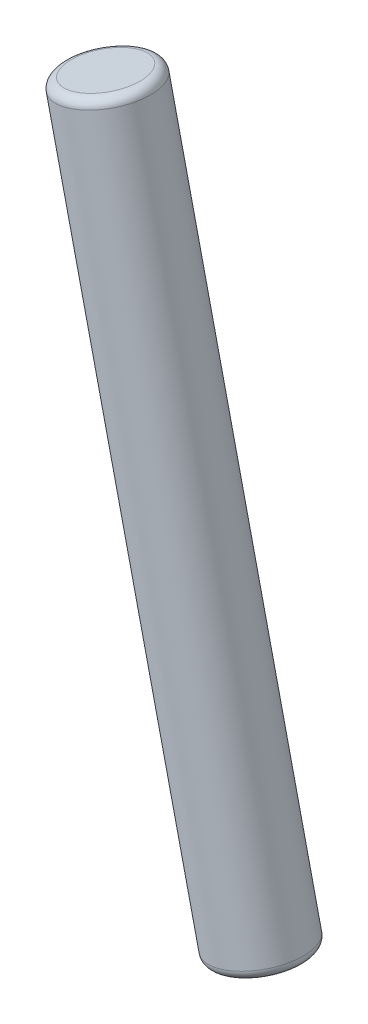
ISO-10303-21;
HEADER;
FILE_DESCRIPTION(('STEP AP214'),'2;1');
FILE_NAME('part.step','',(''),(''),'','','');
FILE_SCHEMA(('AUTOMOTIVE_DESIGN { 1 0 10303 214 1 1 1 1 }'));
ENDSEC;
DATA;
#1=APPLICATION_CONTEXT('core data for automotive mechanical design processes');
#2=APPLICATION_PROTOCOL_DEFINITION('international standard','automotive_design',2000,#1);
#3=PRODUCT_CONTEXT('',#1,'mechanical');
#4=PRODUCT('Part','Part','',(#3));
#5=PRODUCT_RELATED_PRODUCT_CATEGORY('part','',(#4));
#6=PRODUCT_DEFINITION_FORMATION('','',#4);
#7=PRODUCT_DEFINITION_CONTEXT('part definition',#1,'design');
#8=PRODUCT_DEFINITION('design','',#6,#7);
#9=PRODUCT_DEFINITION_SHAPE('','',#8);
#10=(LENGTH_UNIT() NAMED_UNIT(*) SI_UNIT(.MILLI.,.METRE.));
#11=(NAMED_UNIT(*) PLANE_ANGLE_UNIT() SI_UNIT($,.RADIAN.));
#12=(NAMED_UNIT(*) SI_UNIT($,.STERADIAN.) SOLID_ANGLE_UNIT());
#13=UNCERTAINTY_MEASURE_WITH_UNIT(LENGTH_MEASURE(1.E-05),#10,'distance_accuracy_value','');
#14=(GEOMETRIC_REPRESENTATION_CONTEXT(3) GLOBAL_UNCERTAINTY_ASSIGNED_CONTEXT((#13)) GLOBAL_UNIT_ASSIGNED_CONTEXT((#10,
#11,#12)) REPRESENTATION_CONTEXT('',''));
#15=CARTESIAN_POINT('',(0.,0.,0.));
#16=DIRECTION('',(0.,0.,1.));
#17=DIRECTION('',(1.,0.,0.));
#18=AXIS2_PLACEMENT_3D('',#15,#16,#17);
#19=CARTESIAN_POINT('',(-21.1730605528005,-15.0897815367699,0.));
#20=DIRECTION('',(-0.222520933956318,0.974927912181823,0.));
#21=DIRECTION('',(-0.974927912181823,-0.222520933956318,0.));
#22=AXIS2_PLACEMENT_3D('',#19,#20,#21);
#23=PLANE('',#22);
#24=CARTESIAN_POINT('',(-20.1981628401016,-14.8672674956484,0.00787091342527407));
#25=CARTESIAN_POINT('',(-20.1981529206122,-14.8672652315897,0.00657899610447102));
#26=CARTESIAN_POINT('',(-20.1981454142962,-14.8672635183221,0.00528705543710076));
#27=CARTESIAN_POINT('',(-20.1981377041067,-14.8672617585216,0.00333422628621672));
#28=CARTESIAN_POINT('',(-20.1981357242379,-14.8672613066294,0.00267334428524257));
#29=CARTESIAN_POINT('',(-20.1981330009584,-14.8672606850585,0.00134164303913538));
#30=CARTESIAN_POINT('',(-20.1981322765856,-14.8672605197251,0.000670823783469052));
#31=CARTESIAN_POINT('',(-20.1981306354053,-14.8672601451333,-0.0159212011125763));
#32=CARTESIAN_POINT('',(-20.198499718446,-14.8673443859071,-0.0318449527190452));
#33=CARTESIAN_POINT('',(-20.1999788641754,-14.8676819911907,-0.0636549444015571));
#34=CARTESIAN_POINT('',(-20.2010889305999,-14.8679353565532,-0.0795411842880794));
#35=CARTESIAN_POINT('',(-20.2040473820285,-14.8686106036455,-0.111241607180565));
#36=CARTESIAN_POINT('',(-20.2058957706376,-14.8690324861982,-0.127055789834311));
#37=CARTESIAN_POINT('',(-20.2103266922091,-14.8700438149343,-0.158575555767159));
#38=CARTESIAN_POINT('',(-20.2129092286395,-14.8706332619093,-0.174281138532882));
#39=CARTESIAN_POINT('',(-20.2188025506129,-14.8719783739428,-0.205547989830039));
#40=CARTESIAN_POINT('',(-20.2221133394804,-14.8727340397601,-0.221109257702315));
#41=CARTESIAN_POINT('',(-20.2294556194903,-14.8744098669646,-0.252051934002707));
#42=CARTESIAN_POINT('',(-20.2334871138085,-14.8753300290767,-0.267433341637972));
#43=CARTESIAN_POINT('',(-20.2422616169504,-14.8773327518254,-0.297981219665877));
#44=CARTESIAN_POINT('',(-20.2470046287963,-14.8784153131517,-0.313147689145244));
#45=CARTESIAN_POINT('',(-20.2571913294509,-14.8807403607331,-0.343231033536705));
#46=CARTESIAN_POINT('',(-20.2626350211245,-14.881982847642,-0.35814790742796));
#47=CARTESIAN_POINT('',(-20.2743764120553,-14.8846627430991,-0.388121107085888));
#48=CARTESIAN_POINT('',(-20.280694097989,-14.8861047134753,-0.403169200309476));
#49=CARTESIAN_POINT('',(-20.2940424687571,-14.8891513915631,-0.432928942456398));
#50=CARTESIAN_POINT('',(-20.3010731563542,-14.8907560999052,-0.447640590075863));
#51=CARTESIAN_POINT('',(-20.3158305786899,-14.8941243847987,-0.476691971272723));
#52=CARTESIAN_POINT('',(-20.3235573160084,-14.895887961939,-0.491031703471306));
#53=CARTESIAN_POINT('',(-20.3396881837559,-14.8995697267706,-0.51930461693864));
#54=CARTESIAN_POINT('',(-20.3480923165819,-14.9014879150091,-0.533237796768499));
#55=CARTESIAN_POINT('',(-20.365557691255,-14.9054742723284,-0.560663967422917));
#56=CARTESIAN_POINT('',(-20.3746189353169,-14.9075424419147,-0.574156956763503));
#57=CARTESIAN_POINT('',(-20.3933766600057,-14.9118237696867,-0.600670166365145));
#58=CARTESIAN_POINT('',(-20.403073142667,-14.9140369283367,-0.613690385111834));
#59=CARTESIAN_POINT('',(-20.4230779384937,-14.9186028919574,-0.639226616049456));
#60=CARTESIAN_POINT('',(-20.4333862535158,-14.920955697352,-0.651742626710038));
#61=CARTESIAN_POINT('',(-20.4545898303905,-14.9257952749277,-0.676240220942178));
#62=CARTESIAN_POINT('',(-20.4654850939258,-14.928282047493,-0.688221802981449));
#63=CARTESIAN_POINT('',(-20.4878362667652,-14.9333835563665,-0.711621609794442));
#64=CARTESIAN_POINT('',(-20.4992921775823,-14.93599829302,-0.723039833047573));
#65=CARTESIAN_POINT('',(-20.5227369900062,-14.9413494180033,-0.745285352228174));
#66=CARTESIAN_POINT('',(-20.5347258929618,-14.9440858066409,-0.756112646659907));
#67=CARTESIAN_POINT('',(-20.5592077475544,-14.9496736297466,-0.777150164873108));
#68=CARTESIAN_POINT('',(-20.5717007003824,-14.9525250644865,-0.787360387196323));
#69=CARTESIAN_POINT('',(-20.5971604953677,-14.9583360961232,-0.807139107738218));
#70=CARTESIAN_POINT('',(-20.6101273385652,-14.9612956932573,-0.816707604548179));
#71=CARTESIAN_POINT('',(-20.6365036105227,-14.9673159048033,-0.835179770026621));
#72=CARTESIAN_POINT('',(-20.6499130401798,-14.97037651942,-0.844083437347339));
#73=CARTESIAN_POINT('',(-20.677142112467,-14.9765913771001,-0.861204445029838));
#74=CARTESIAN_POINT('',(-20.6909617558598,-14.9797456203376,-0.869421784115556));
#75=CARTESIAN_POINT('',(-20.7189778923812,-14.9861401203195,-0.885150293656153));
#76=CARTESIAN_POINT('',(-20.7331743861472,-14.9893803772093,-0.892661462916689));
#77=CARTESIAN_POINT('',(-20.7619099500974,-14.9959390818358,-0.90695949620411));
#78=CARTESIAN_POINT('',(-20.7764490208035,-14.9992575296916,-0.913746359127632));
#79=CARTESIAN_POINT('',(-20.805834638002,-15.0059646047609,-0.926579392012809));
#80=CARTESIAN_POINT('',(-20.8206811849112,-15.0093532320695,-0.932625560970542));
#81=CARTESIAN_POINT('',(-20.8506459113342,-15.0161924850729,-0.94396260665208));
#82=CARTESIAN_POINT('',(-20.8657640911704,-15.0196431108414,-0.949253482479032));
#83=CARTESIAN_POINT('',(-20.8962355842741,-15.026598030067,-0.959067166345111));
#84=CARTESIAN_POINT('',(-20.9115888977813,-15.030102323579,-0.963589973601217));
#85=CARTESIAN_POINT('',(-20.9424935912044,-15.0371561179864,-0.971856599347137));
#86=CARTESIAN_POINT('',(-20.9580449712891,-15.0407056189204,-0.975600417173629));
#87=CARTESIAN_POINT('',(-20.989308252511,-15.0478412586898,-0.982300024035243));
#88=CARTESIAN_POINT('',(-21.0050201537579,-15.0514273975502,-0.985255812531696));
#89=CARTESIAN_POINT('',(-21.0365665442839,-15.0586276552087,-0.990372223496477));
#90=CARTESIAN_POINT('',(-21.0524010336262,-15.0622417740211,-0.992532845554805));
#91=CARTESIAN_POINT('',(-21.0841543712652,-15.0694892660462,-0.996053706434051));
#92=CARTESIAN_POINT('',(-21.1000732195912,-15.0731226392656,-0.997413944976703));
#93=CARTESIAN_POINT('',(-21.1319568423842,-15.080399868066,-0.9993307542445));
#94=CARTESIAN_POINT('',(-21.1479216168594,-15.0840437236488,-0.999887324825211));
#95=CARTESIAN_POINT('',(-21.1798585482158,-15.0913331198202,-1.00019545415205));
#96=CARTESIAN_POINT('',(-21.195830705097,-15.0949786604088,-0.999947012888708));
#97=CARTESIAN_POINT('',(-21.2277438396909,-15.1022626251637,-0.998645718320171));
#98=CARTESIAN_POINT('',(-21.2436848174083,-15.1059010493312,-0.997592865140611));
#99=CARTESIAN_POINT('',(-21.2754971073851,-15.1131619969994,-0.994685288894073));
#100=CARTESIAN_POINT('',(-21.2913684196672,-15.1167845205054,-0.992830566087005));
#101=CARTESIAN_POINT('',(-21.3230030607127,-15.124004921003,-0.988323728962072));
#102=CARTESIAN_POINT('',(-21.3387663895293,-15.1276027980068,-0.985671615036586));
#103=CARTESIAN_POINT('',(-21.3701470063489,-15.1347652191705,-0.979576399457556));
#104=CARTESIAN_POINT('',(-21.3857642944484,-15.1383297633524,-0.976133298326086));
#105=CARTESIAN_POINT('',(-21.4168151252113,-15.1454169130377,-0.968464422057429));
#106=CARTESIAN_POINT('',(-21.4322486680268,-15.1489395185759,-0.964238647568278));
#107=CARTESIAN_POINT('',(-21.4628947473271,-15.1559342864171,-0.955014628166624));
#108=CARTESIAN_POINT('',(-21.478107284032,-15.1594064487703,-0.950016384023447));
#109=CARTESIAN_POINT('',(-21.5082746239271,-15.1662919475009,-0.939259494111981));
#110=CARTESIAN_POINT('',(-21.5232294274173,-15.1697052839466,-0.93350084922871));
#111=CARTESIAN_POINT('',(-21.552845196104,-15.1764648901812,-0.921237062702011));
#112=CARTESIAN_POINT('',(-21.567506161692,-15.1798111600592,-0.914731922052795));
#113=CARTESIAN_POINT('',(-21.5964988593908,-15.1864285544378,-0.900990851342103));
#114=CARTESIAN_POINT('',(-21.6108305919955,-15.189699679051,-0.893754922376661));
#115=CARTESIAN_POINT('',(-21.6391302236164,-15.196158885649,-0.878569746927125));
#116=CARTESIAN_POINT('',(-21.6530981232393,-15.1993469677723,-0.870620501632671));
#117=CARTESIAN_POINT('',(-21.6806363674131,-15.2056323926807,-0.854027887765389));
#118=CARTESIAN_POINT('',(-21.6942067126936,-15.2087297356324,-0.845384520466777));
#119=CARTESIAN_POINT('',(-21.7209170867604,-15.2148262046155,-0.82742453281922));
#120=CARTESIAN_POINT('',(-21.7340571164087,-15.2178253308436,-0.818107913819262));
#121=CARTESIAN_POINT('',(-21.7598751369643,-15.2237181259824,-0.798823918578047));
#122=CARTESIAN_POINT('',(-21.7725531288749,-15.226611795122,-0.788856543750011));
#123=CARTESIAN_POINT('',(-21.7974164674883,-15.2322866903557,-0.768295103909819));
#124=CARTESIAN_POINT('',(-21.8096018153437,-15.235067916713,-0.757701040363885));
#125=CARTESIAN_POINT('',(-21.8334504490688,-15.2405112121928,-0.735911803265544));
#126=CARTESIAN_POINT('',(-21.8451137362475,-15.2431732816142,-0.724716631220487));
#127=CARTESIAN_POINT('',(-21.8678900925654,-15.2483718367848,-0.701752208639952));
#128=CARTESIAN_POINT('',(-21.8790031631765,-15.2509083228701,-0.689982959640478));
#129=CARTESIAN_POINT('',(-21.9006522590189,-15.2558495882013,-0.66589880071838));
#130=CARTESIAN_POINT('',(-21.9111882858909,-15.2582543678218,-0.653583892347394));
#131=CARTESIAN_POINT('',(-21.9316578604086,-15.262926415112,-0.628438149666163));
#132=CARTESIAN_POINT('',(-21.9415914098685,-15.2651936831958,-0.615607316909679));
#133=CARTESIAN_POINT('',(-21.960832050624,-15.2695852343743,-0.589460706041784));
#134=CARTESIAN_POINT('',(-21.9701391439112,-15.2717095179235,-0.57614492947231));
#135=CARTESIAN_POINT('',(-21.9881044061904,-15.2758099722831,-0.549060582338917));
#136=CARTESIAN_POINT('',(-21.9967625773545,-15.2777861435891,-0.535292013290786));
#137=CARTESIAN_POINT('',(-22.0134090963114,-15.2815856033819,-0.507335325685179));
#138=CARTESIAN_POINT('',(-22.0213974464587,-15.2834088924061,-0.493147208602702));
#139=CARTESIAN_POINT('',(-22.0366850418155,-15.2868981867412,-0.464385682246527));
#140=CARTESIAN_POINT('',(-22.0439842895631,-15.2885641926314,-0.449812274392143));
#141=CARTESIAN_POINT('',(-22.0578760626346,-15.2917348996195,-0.420315353907216));
#142=CARTESIAN_POINT('',(-22.0644685906802,-15.2932396013387,-0.405391842625215));
#143=CARTESIAN_POINT('',(-22.0769310134117,-15.296084068415,-0.375230747810346));
#144=CARTESIAN_POINT('',(-22.082800911002,-15.2974238344349,-0.359993165540032));
#145=CARTESIAN_POINT('',(-22.0938039070866,-15.2999351968728,-0.329240719374494));
#146=CARTESIAN_POINT('',(-22.0989370086659,-15.301106793995,-0.313725856640557));
#147=CARTESIAN_POINT('',(-22.1084540255001,-15.3032789913304,-0.282456309368366));
#148=CARTESIAN_POINT('',(-22.1128379440178,-15.3042795922884,-0.26670162587486));
#149=CARTESIAN_POINT('',(-22.1208460192198,-15.3061073835015,-0.234990475823799));
#150=CARTESIAN_POINT('',(-22.1244701793405,-15.3069345745409,-0.219034010179252));
#151=CARTESIAN_POINT('',(-22.1309499871257,-15.3084135486413,-0.186957820893023));
#152=CARTESIAN_POINT('',(-22.1338056383953,-15.309065332525,-0.170838098017548));
#153=CARTESIAN_POINT('',(-22.1387415699755,-15.310191926902,-0.138474315331791));
#154=CARTESIAN_POINT('',(-22.1408218540536,-15.3106667382553,-0.12223025612605));
#155=CARTESIAN_POINT('',(-22.1442019293005,-15.3114382185162,-0.0896570137287813));
#156=CARTESIAN_POINT('',(-22.1455017243928,-15.3117348883194,-0.0733278309655872));
#157=CARTESIAN_POINT('',(-22.1473180909544,-15.3121494622092,-0.0406237893278862));
#158=CARTESIAN_POINT('',(-22.1478346664926,-15.3122673672245,-0.024248930691109));
#159=CARTESIAN_POINT('',(-22.1479582654995,-15.3122955778913,-0.00787091342531694));
#160=B_SPLINE_CURVE_WITH_KNOTS('',3,(#24,#25,#26,#27,#28,#29,#30,#31,#32,#33,#34,#35,#36,#37,
#38,#39,#40,#41,#42,#43,#44,#45,#46,#47,#48,#49,#50,#51,#52,#53,#54,#55,#56,#57,#58,#59,#60,#61,
#62,#63,#64,#65,#66,#67,#68,#69,#70,#71,#72,#73,#74,#75,#76,#77,#78,#79,#80,#81,#82,#83,#84,#85,
#86,#87,#88,#89,#90,#91,#92,#93,#94,#95,#96,#97,#98,#99,#100,#101,#102,#103,#104,#105,#106,#107,
#108,#109,#110,#111,#112,#113,#114,#115,#116,#117,#118,#119,#120,#121,#122,#123,#124,#125,#126,
#127,#128,#129,#130,#131,#132,#133,#134,#135,#136,#137,#138,#139,#140,#141,#142,#143,#144,#145,
#146,#147,#148,#149,#150,#151,#152,#153,#154,#155,#156,#157,#158,#159),.UNSPECIFIED.,.F.,.F.,(4,
2,2,2,2,2,2,2,2,2,2,2,2,2,2,2,2,2,2,2,2,2,2,2,2,2,2,2,2,2,2,2,2,2,2,2,2,2,2,2,2,2,2,2,2,2,2,2,2,
2,2,2,2,2,2,2,2,2,2,2,2,2,2,2,2,2,2,4),(0.,0.00387587630935156,0.00585852972615721,
0.0078709928851933,0.0556344018089354,0.10339805153398,0.151161934478224,0.198926043059565,
0.246690369695901,0.294454906805128,0.342219646805145,0.389984582113849,0.43911689607388,
0.488249400409967,0.537382086870033,0.586514947201998,0.635647973153784,0.684781156473313,
0.733914488908506,0.783047962207284,0.832181568117571,0.881315298387288,0.930449144764357,
0.979583098996699,1.02871715283224,1.07785129801889,1.12698552630459,1.17611982943724,
1.22525419916478,1.27438862723513,1.3235231053962,1.37265762539593,1.42179217898223,
1.47092675790302,1.52006135390623,1.56919595873978,1.61833056415159,1.66746516188958,
1.71659974370168,1.76573430133581,1.81486882653989,1.86400331106185,1.9131377466496,
1.96227212505107,2.01140643801417,2.06054067728684,2.10967483461699,2.15880890175256,
2.20794287044145,2.25707673243158,2.30621047947089,2.3553441033073,2.40447759568871,
2.45361094836307,2.50274415307829,2.55187720158229,2.60101008562299,2.65014279694831,
2.69927532730618,2.74840766844452,2.79753981211125,2.84667175005429,2.89580347402156,
2.94493497576098,2.99406624702048,3.04319727954798,3.0923280650914,3.14145859539866),.UNSPECIFIED.);
#161=CARTESIAN_POINT('',(-20.1981628401016,-14.8672674956484,0.00787091342527407));
#162=VERTEX_POINT('',#161);
#163=CARTESIAN_POINT('',(-22.1479582654995,-15.3122955778913,-0.00787091342531667));
#164=VERTEX_POINT('',#163);
#165=EDGE_CURVE('E44',#162,#164,#160,.T.);
#166=ORIENTED_EDGE('',*,*,#165,.F.);
#167=CARTESIAN_POINT('',(-21.1730605528005,-15.0897815367699,0.));
#168=DIRECTION('',(0.222520933956318,-0.974927912181823,0.));
#169=DIRECTION('',(0.974927912181823,0.222520933956318,0.));
#170=AXIS2_PLACEMENT_3D('',#167,#168,#169);
#171=CIRCLE('',#170,0.999999999999997);
#172=EDGE_CURVE('E22',#164,#162,#171,.F.);
#173=ORIENTED_EDGE('',*,*,#172,.F.);
#174=EDGE_LOOP('',(#166,#173));
#175=FACE_BOUND('',#174,.T.);
#176=ADVANCED_FACE('F17',(#175),#23,.F.);
#177=CARTESIAN_POINT('',(-25.6234792319269,4.4087767068666,0.));
#178=DIRECTION('',(-0.222520933956318,0.974927912181823,0.));
#179=DIRECTION('',(-0.974927912181823,-0.222520933956318,0.));
#180=AXIS2_PLACEMENT_3D('',#177,#178,#179);
#181=PLANE('',#180);
#182=CARTESIAN_POINT('',(-24.6485815192279,4.63129074798801,0.00787091342531693));
#183=CARTESIAN_POINT('',(-24.6486727398425,4.631269927478,0.0197705211102563));
#184=CARTESIAN_POINT('',(-24.6489712283922,4.63120179941436,0.0316684493908223));
#185=CARTESIAN_POINT('',(-24.6499819451551,4.63097110990877,0.0554458036296425));
#186=CARTESIAN_POINT('',(-24.6506941733684,4.6308085484668,0.0673252295878968));
#187=CARTESIAN_POINT('',(-24.6525315732524,4.63038917393345,0.0910504356685289));
#188=CARTESIAN_POINT('',(-24.653656744923,4.63013236084206,0.102896215790907));
#189=CARTESIAN_POINT('',(-24.6563185680055,4.6295248170935,0.126539035880564));
#190=CARTESIAN_POINT('',(-24.6578552194173,4.62917408643634,0.138336075847843));
#191=CARTESIAN_POINT('',(-24.6613380517521,4.62837915268353,0.161866381727179));
#192=CARTESIAN_POINT('',(-24.663284232675,4.62793494958789,0.173599647639236));
#193=CARTESIAN_POINT('',(-24.6675836417755,4.62695363751698,0.196987453231987));
#194=CARTESIAN_POINT('',(-24.6699368699529,4.62641652854172,0.208641992912681));
#195=CARTESIAN_POINT('',(-24.6750473753036,4.6252500890446,0.231857494069693));
#196=CARTESIAN_POINT('',(-24.6778046524767,4.62462075852275,0.243418455546011));
#197=CARTESIAN_POINT('',(-24.6837197419322,4.62327067795411,0.266432067605087));
#198=CARTESIAN_POINT('',(-24.6868775542145,4.62254992790731,0.277884718187845));
#199=CARTESIAN_POINT('',(-24.6935896897757,4.62101792676626,0.300667113787736));
#200=CARTESIAN_POINT('',(-24.6971440130545,4.62020667567199,0.311996858804868));
#201=CARTESIAN_POINT('',(-24.7046446411504,4.61849470625526,0.334519005228325));
#202=CARTESIAN_POINT('',(-24.7085909459675,4.6175939879328,0.34571140663465));
#203=CARTESIAN_POINT('',(-24.7168705081746,4.61570423188823,0.367944602814335));
#204=CARTESIAN_POINT('',(-24.7212037655646,4.61471519416612,0.378985397587695));
#205=CARTESIAN_POINT('',(-24.7302517108357,4.61265005970135,0.400901310679173));
#206=CARTESIAN_POINT('',(-24.7349663987169,4.61157396295869,0.411776428997291));
#207=CARTESIAN_POINT('',(-24.7447711968143,4.60933608177523,0.433347130485538));
#208=CARTESIAN_POINT('',(-24.7498613070306,4.60817429733444,0.444042713655666));
#209=CARTESIAN_POINT('',(-24.7604104632229,4.60576652127321,0.465240714945576));
#210=CARTESIAN_POINT('',(-24.765869509199,4.60452052965278,0.475743133065357));
#211=CARTESIAN_POINT('',(-24.7771495801829,4.60194592706005,0.496541420511842));
#212=CARTESIAN_POINT('',(-24.7829706051907,4.60061731608775,0.506837289838545));
#213=CARTESIAN_POINT('',(-24.7949672162225,4.59787916790495,0.527209359171327));
#214=CARTESIAN_POINT('',(-24.8011428022465,4.59646963069444,0.537285559177404));
#215=CARTESIAN_POINT('',(-24.8138406654606,4.59357142627711,0.557205449276696));
#216=CARTESIAN_POINT('',(-24.8203629426508,4.59208275907028,0.56704913936991));
#217=CARTESIAN_POINT('',(-24.8337458765421,4.5890281917414,0.586491465349938));
#218=CARTESIAN_POINT('',(-24.8406065332432,4.58746229161935,0.596090101236751));
#219=CARTESIAN_POINT('',(-24.8546574832873,4.58425525396279,0.615030086794951));
#220=CARTESIAN_POINT('',(-24.8618477766304,4.58261411642829,0.624371436466336));
#221=CARTESIAN_POINT('',(-24.8765488370177,4.57925869532827,0.642784945456996));
#222=CARTESIAN_POINT('',(-24.8840596040619,4.57754441176276,0.651857104776272));
#223=CARTESIAN_POINT('',(-24.8993920405154,4.57404488319576,0.669720671968407));
#224=CARTESIAN_POINT('',(-24.9072137099246,4.57225963819426,0.678512079841267));
#225=CARTESIAN_POINT('',(-24.923157983574,4.5686204617799,0.695802940821497));
#226=CARTESIAN_POINT('',(-24.9312805878141,4.56676653036704,0.704302393928868));
#227=CARTESIAN_POINT('',(-24.9478163800952,4.56299234368501,0.720998514111224));
#228=CARTESIAN_POINT('',(-24.9562295681362,4.56107208841583,0.729195181186209));
#229=CARTESIAN_POINT('',(-24.9733358066839,4.55716770109596,0.745275283891874));
#230=CARTESIAN_POINT('',(-24.9820288571906,4.55518356904526,0.753158719522555));
#231=CARTESIAN_POINT('',(-24.9996837426922,4.55115395663841,0.768602313093776));
#232=CARTESIAN_POINT('',(-25.0086455776872,4.54910847628226,0.776162471034315));
#233=CARTESIAN_POINT('',(-25.0268266116626,4.54495877391969,0.790949874947917));
#234=CARTESIAN_POINT('',(-25.0360458106431,4.54285455191329,0.798177120920978));
#235=CARTESIAN_POINT('',(-25.0547298241157,4.53859004776277,0.812289490868213));
#236=CARTESIAN_POINT('',(-25.0641946386077,4.53642976561865,0.819174614842387));
#237=CARTESIAN_POINT('',(-25.0833578216292,4.53205589414544,0.832593966743157));
#238=CARTESIAN_POINT('',(-25.0930561901588,4.52984230481634,0.839128194669753));
#239=CARTESIAN_POINT('',(-25.1126741221523,4.52536463985779,0.851837427590597));
#240=CARTESIAN_POINT('',(-25.1225936856162,4.52310056422835,0.858012432584845));
#241=CARTESIAN_POINT('',(-25.1426413664958,4.51852481189093,0.869995350531482));
#242=CARTESIAN_POINT('',(-25.1527694839114,4.51621313518296,0.875803263483871));
#243=CARTESIAN_POINT('',(-25.1732213659413,4.51154512657064,0.887044596040594));
#244=CARTESIAN_POINT('',(-25.1835451305555,4.5091887946663,0.892478015644928));
#245=CARTESIAN_POINT('',(-25.2043751509067,4.50443447844974,0.902963437434242));
#246=CARTESIAN_POINT('',(-25.2148814066436,4.50203649413751,0.908015439619223));
#247=CARTESIAN_POINT('',(-25.236063020607,4.4972019289733,0.917731588558101));
#248=CARTESIAN_POINT('',(-25.2467383788335,4.49476534812132,0.922395735312));
#249=CARTESIAN_POINT('',(-25.2682445936471,4.48985669493129,0.931330229637123));
#250=CARTESIAN_POINT('',(-25.2790754502342,4.48738462259324,0.935600577208347));
#251=CARTESIAN_POINT('',(-25.3008788594822,4.48240813671293,0.943742031264905));
#252=CARTESIAN_POINT('',(-25.3118514121431,4.47990372317066,0.947613137750238));
#253=CARTESIAN_POINT('',(-25.3339242306763,4.47486574637907,0.954951176463461));
#254=CARTESIAN_POINT('',(-25.3450244965485,4.47233218312975,0.958418108691351));
#255=CARTESIAN_POINT('',(-25.367338595912,4.46723913556312,0.964943380928916));
#256=CARTESIAN_POINT('',(-25.3785524294034,4.46467965124583,0.96800172093859));
#257=CARTESIAN_POINT('',(-25.4010793736073,4.45953802323333,0.97370591090121));
#258=CARTESIAN_POINT('',(-25.4123924843198,4.45695587953813,0.976351760854155));
#259=CARTESIAN_POINT('',(-25.4351035663572,4.45177222326678,0.981227600635916));
#260=CARTESIAN_POINT('',(-25.4465015376821,4.44917071069063,0.983457590464732));
#261=CARTESIAN_POINT('',(-25.4693678150627,4.44395163209481,0.987498861988522));
#262=CARTESIAN_POINT('',(-25.4808361211184,4.44133406607515,0.989310143683495));
#263=CARTESIAN_POINT('',(-25.5038284566678,4.43608621552538,0.992511713967561));
#264=CARTESIAN_POINT('',(-25.5153524861613,4.43345593099527,0.993902002556654));
#265=CARTESIAN_POINT('',(-25.5384415705354,4.42818599815595,0.996259728211989));
#266=CARTESIAN_POINT('',(-25.5500066254158,4.42554634984673,0.997227165278232));
#267=CARTESIAN_POINT('',(-25.5731630689998,4.42026104271349,0.998738278621432));
#268=CARTESIAN_POINT('',(-25.5847544577033,4.41761538388948,0.999281954898388));
#269=CARTESIAN_POINT('',(-25.6079486244869,4.41232146665895,0.999943646191528));
#270=CARTESIAN_POINT('',(-25.6195514025669,4.40967320825244,1.00006166120771));
#271=CARTESIAN_POINT('',(-25.645643576657,4.40371783986038,0.999853314911651));
#272=CARTESIAN_POINT('',(-25.6601322021869,4.400410905765,0.999408959966023));
#273=CARTESIAN_POINT('',(-25.6890764901318,4.3938045596284,0.997869482750393));
#274=CARTESIAN_POINT('',(-25.7035321522001,4.39050514766629,0.996774353668499));
#275=CARTESIAN_POINT('',(-25.7323832108877,4.38392007187152,0.993933824075528));
#276=CARTESIAN_POINT('',(-25.7467786050019,4.38063440861033,0.992188396800902));
#277=CARTESIAN_POINT('',(-25.7754821887063,4.37408296889025,0.988051197711372));
#278=CARTESIAN_POINT('',(-25.7897903719567,4.37081719387716,0.985659379466702));
#279=CARTESIAN_POINT('',(-25.8147282167299,4.36512522446154,0.980911120931172));
#280=CARTESIAN_POINT('',(-25.8253835667641,4.36269317291061,0.978695218076478));
#281=CARTESIAN_POINT('',(-25.8466193129747,4.35784614918942,0.973906846120255));
#282=CARTESIAN_POINT('',(-25.857199702,4.35543117864869,0.971334343468757));
#283=CARTESIAN_POINT('',(-25.8747444681466,4.35142657876104,0.966746313352115));
#284=CARTESIAN_POINT('',(-25.8817343139803,4.34983114034073,0.964832397982198));
#285=CARTESIAN_POINT('',(-25.9026358232922,4.34506037304327,0.958839565105304));
#286=CARTESIAN_POINT('',(-25.9164799920304,4.34190047036779,0.954509435152599));
#287=CARTESIAN_POINT('',(-25.9439561260851,4.33562917345549,0.945194476612272));
#288=CARTESIAN_POINT('',(-25.9575880982137,4.33251777766145,0.940209669090303));
#289=CARTESIAN_POINT('',(-25.9846102016045,4.32635025619598,0.929596536395554));
#290=CARTESIAN_POINT('',(-25.9980003613493,4.32329412401513,0.923968287592204));
#291=CARTESIAN_POINT('',(-26.0245064891641,4.31724447275329,0.912075932700987));
#292=CARTESIAN_POINT('',(-26.0376225128719,4.31425094096705,0.905811957179647));
#293=CARTESIAN_POINT('',(-26.0570768147116,4.30981076693233,0.895964544510993));
#294=CARTESIAN_POINT('',(-26.0635245155947,4.30833916422467,0.892607083135159));
#295=CARTESIAN_POINT('',(-26.0763296153199,4.30541654185101,0.885718664694046));
#296=CARTESIAN_POINT('',(-26.0826870290912,4.30396551878215,0.882187736752998));
#297=CARTESIAN_POINT('',(-26.0943455909889,4.30130453729139,0.875628437439713));
#298=CARTESIAN_POINT('',(-26.0996523582752,4.30009329933085,0.872610454892624));
#299=CARTESIAN_POINT('',(-26.1152240275099,4.29653916296562,0.863561959756415));
#300=CARTESIAN_POINT('',(-26.1254124031318,4.29421373522682,0.857391890410283));
#301=CARTESIAN_POINT('',(-26.1507523372726,4.28843005519174,0.841411274862042));
#302=CARTESIAN_POINT('',(-26.1657608192099,4.28500445315153,0.831360820410464));
#303=CARTESIAN_POINT('',(-26.1939540792053,4.27856948433449,0.81131918297202));
#304=CARTESIAN_POINT('',(-26.2071851039081,4.27554956329675,0.801396323757868));
#305=CARTESIAN_POINT('',(-26.2310228689945,4.27010870371595,0.782541001249091));
#306=CARTESIAN_POINT('',(-26.2417061194557,4.26767030184119,0.773710362493863));
#307=CARTESIAN_POINT('',(-26.2562051298408,4.2643609815464,0.76118556792131));
#308=CARTESIAN_POINT('',(-26.2601848628479,4.2634526302968,0.757689649577746));
#309=CARTESIAN_POINT('',(-26.2714378534126,4.26088420279717,0.747638758182108));
#310=CARTESIAN_POINT('',(-26.2786429154649,4.25923969441018,0.741003023091419));
#311=CARTESIAN_POINT('',(-26.2928543169016,4.25599603929804,0.727512021845974));
#312=CARTESIAN_POINT('',(-26.2998606591347,4.25439689192258,0.720656758841462));
#313=CARTESIAN_POINT('',(-26.3159692198466,4.25072023412908,0.7044115735956));
#314=CARTESIAN_POINT('',(-26.3249917968913,4.24866090319073,0.694938290394925));
#315=CARTESIAN_POINT('',(-26.3426567835337,4.24462901680971,0.675627254432975));
#316=CARTESIAN_POINT('',(-26.3512992154189,4.2426564562798,0.665789523101306));
#317=CARTESIAN_POINT('',(-26.368190815356,4.2388010944753,0.645766333996917));
#318=CARTESIAN_POINT('',(-26.3764400153345,4.23691828591373,0.635580904569478));
#319=CARTESIAN_POINT('',(-26.3925281853735,4.23324629262188,0.61487636514271));
#320=CARTESIAN_POINT('',(-26.4003671979902,4.2314570981793,0.604357289941119));
#321=CARTESIAN_POINT('',(-26.4142986900813,4.22827732620547,0.584881451170083));
#322=CARTESIAN_POINT('',(-26.4204565870814,4.22687182040577,0.575973761195909));
#323=CARTESIAN_POINT('',(-26.4324985116458,4.22412331927604,0.557966601516301));
#324=CARTESIAN_POINT('',(-26.4383825584813,4.2227803195474,0.54886714537132));
#325=CARTESIAN_POINT('',(-26.4498685760271,4.22015870883001,0.530482985255211));
#326=CARTESIAN_POINT('',(-26.4554705536758,4.21888009625748,0.521198285848513));
#327=CARTESIAN_POINT('',(-26.4663869127388,4.21638851756711,0.502452899402465));
#328=CARTESIAN_POINT('',(-26.4717012880358,4.21517555284558,0.492992208625541));
#329=CARTESIAN_POINT('',(-26.4846261003046,4.21222555630912,0.469131816998046));
#330=CARTESIAN_POINT('',(-26.4920557837593,4.21052977561428,0.454628069240343));
#331=CARTESIAN_POINT('',(-26.5014918646483,4.2083759997133,0.435072706871333));
#332=CARTESIAN_POINT('',(-26.5038071391678,4.20784753656157,0.430175846321435));
#333=CARTESIAN_POINT('',(-26.510627281505,4.20629083415064,0.415423400917842));
#334=CARTESIAN_POINT('',(-26.5150063774266,4.2052913026324,0.405506131918163));
#335=CARTESIAN_POINT('',(-26.5234299871527,4.20336862747701,0.385523188353363));
#336=CARTESIAN_POINT('',(-26.5274744924019,4.20244548579314,0.375457510001195));
#337=CARTESIAN_POINT('',(-26.5352180320815,4.20067808161859,0.355187906999682));
#338=CARTESIAN_POINT('',(-26.5389170779748,4.19983381651066,0.344983986950321));
#339=CARTESIAN_POINT('',(-26.5459824496052,4.19822124516784,0.324456001449055));
#340=CARTESIAN_POINT('',(-26.5493488059034,4.19745293195594,0.314131947130372));
#341=CARTESIAN_POINT('',(-26.5556810227378,4.19600770481546,0.293357873965597));
#342=CARTESIAN_POINT('',(-26.5586469435547,4.1953307771299,0.282907874337603));
#343=CARTESIAN_POINT('',(-26.5619663321409,4.19457315076111,0.270848765138686));
#344=CARTESIAN_POINT('',(-26.5624011176897,4.19447391360305,0.269261761263503));
#345=CARTESIAN_POINT('',(-26.5640995243569,4.19408626287551,0.263000054622556));
#346=CARTESIAN_POINT('',(-26.5653323695226,4.19380487425102,0.258316499760229));
#347=CARTESIAN_POINT('',(-26.5685244437872,4.19307630442962,0.245833905506397));
#348=CARTESIAN_POINT('',(-26.5704259118467,4.19264230658992,0.23801930348355));
#349=CARTESIAN_POINT('',(-26.5752769559227,4.19153508714278,0.217002966311772));
#350=CARTESIAN_POINT('',(-26.5780575060003,4.19090044470189,0.203759977247555));
#351=CARTESIAN_POINT('',(-26.5839131441992,4.18956393317318,0.172834001034933));
#352=CARTESIAN_POINT('',(-26.5867888543593,4.18890757072226,0.155110687061624));
#353=CARTESIAN_POINT('',(-26.5901467712655,4.18814114762589,0.130299459639902));
#354=CARTESIAN_POINT('',(-26.5910243205125,4.18794085260736,0.123265750354809));
#355=CARTESIAN_POINT('',(-26.5926323189528,4.18757383730633,0.109180632171213));
#356=CARTESIAN_POINT('',(-26.5933627679374,4.18740711707148,0.102129223247607));
#357=CARTESIAN_POINT('',(-26.5956109488725,4.18689398456406,0.0779773236048316));
#358=CARTESIAN_POINT('',(-26.5967718589895,4.18662901481833,0.0608402213206685));
#359=CARTESIAN_POINT('',(-26.5981101047675,4.18632356975503,0.0291314794153301));
#360=CARTESIAN_POINT('',(-26.5984099453238,4.18625513348851,0.0145650857118345));
#361=CARTESIAN_POINT('',(-26.598407147422,4.18625577216487,-0.00262370902903635));
#362=CARTESIAN_POINT('',(-26.5983969138024,4.18625810792255,-0.00524737561468752));
#363=CARTESIAN_POINT('',(-26.5983769446258,4.18626266574517,-0.00787091342527425));
#364=B_SPLINE_CURVE_WITH_KNOTS('',3,(#182,#183,#184,#185,#186,#187,#188,#189,#190,#191,#192,
#193,#194,#195,#196,#197,#198,#199,#200,#201,#202,#203,#204,#205,#206,#207,#208,#209,#210,#211,
#212,#213,#214,#215,#216,#217,#218,#219,#220,#221,#222,#223,#224,#225,#226,#227,#228,#229,#230,
#231,#232,#233,#234,#235,#236,#237,#238,#239,#240,#241,#242,#243,#244,#245,#246,#247,#248,#249,
#250,#251,#252,#253,#254,#255,#256,#257,#258,#259,#260,#261,#262,#263,#264,#265,#266,#267,#268,
#269,#270,#271,#272,#273,#274,#275,#276,#277,#278,#279,#280,#281,#282,#283,#284,#285,#286,#287,
#288,#289,#290,#291,#292,#293,#294,#295,#296,#297,#298,#299,#300,#301,#302,#303,#304,#305,#306,
#307,#308,#309,#310,#311,#312,#313,#314,#315,#316,#317,#318,#319,#320,#321,#322,#323,#324,#325,
#326,#327,#328,#329,#330,#331,#332,#333,#334,#335,#336,#337,#338,#339,#340,#341,#342,#343,#344,
#345,#346,#347,#348,#349,#350,#351,#352,#353,#354,#355,#356,#357,#358,#359,#360,#361,#362,#363),
.UNSPECIFIED.,.F.,.F.,(4,2,2,2,2,2,2,2,2,2,2,2,2,2,2,2,2,2,2,2,2,2,2,2,2,2,2,2,2,2,2,2,2,2,2,2,
2,2,2,2,2,2,2,2,2,2,2,2,2,2,2,2,2,2,2,2,2,2,2,2,2,2,2,2,2,2,2,2,2,2,2,2,2,2,2,2,2,2,2,2,2,2,2,2,
2,2,2,2,2,2,4),(0.,0.0356980207576922,0.0713960415153845,0.107094062273077,0.142792083030769,
0.178490103788461,0.214188124546153,0.249886145303845,0.285584166061538,0.32128218681923,
0.356980207576922,0.392678228334614,0.428376249092306,0.464074269849999,0.49977229060769,
0.535470311365383,0.571168332123075,0.606866352880767,0.642564373638461,0.678262394396152,
0.713960415153845,0.749658435911536,0.785356456669229,0.82105447742692,0.856752498184613,
0.892450518942306,0.928148539699998,0.963846560457689,0.999544581215381,1.03524260197307,
1.07094062273077,1.10663864348846,1.14233666424615,1.17803468500384,1.21373270576154,
1.24943072651923,1.28512874727692,1.32082676803461,1.3565247887923,1.39222280954999,
1.42792083030769,1.46361885106538,1.49931687182307,1.53501489258077,1.57071291333846,
1.6153016482599,1.6598908499161,1.70448188687977,1.749076127635,1.78252590960496,
1.81597884076841,1.83823940074514,1.88275883807235,1.92727684324215,1.97178957008744,
2.01629317327069,2.03854185704162,2.06078681804359,2.07945823667378,2.11585801343596,
2.17098327768522,2.22139798535832,2.26360366846207,2.27972659693338,2.30951832695384,
2.33930962965169,2.37902887141344,2.41874578137315,2.45845946120001,2.49816901260261,
2.53092318704484,2.56367505304553,2.5964261130281,2.62917786934914,2.67830757104394,
2.69463418931896,2.72728803233878,2.75994271005288,2.79259630384072,2.82524689524304,
2.85789256600424,2.86283801742162,2.87739121535236,2.90155189915153,2.94218105316629,
2.99605241104582,3.01732439532839,3.03859640979881,3.09010583195649,3.13380025106883,
3.14167122719714),.UNSPECIFIED.);
#365=CARTESIAN_POINT('',(-24.6485815192279,4.63129074798802,0.00787091342531668));
#366=VERTEX_POINT('',#365);
#367=CARTESIAN_POINT('',(-26.5983769446258,4.18626266574517,-0.00787091342527422));
#368=VERTEX_POINT('',#367);
#369=EDGE_CURVE('E47',#366,#368,#364,.T.);
#370=ORIENTED_EDGE('',*,*,#369,.F.);
#371=CARTESIAN_POINT('',(-24.6485815192279,4.63129074798802,0.00787091342531671));
#372=CARTESIAN_POINT('',(-24.6474879720826,4.63154034298788,-0.134632877705061));
#373=CARTESIAN_POINT('',(-24.6854288272419,4.62288059038498,-0.272435249798421));
#374=CARTESIAN_POINT('',(-24.7334475479279,4.61192063073984,-0.446840744551559));
#375=CARTESIAN_POINT('',(-24.8389569178521,4.58783880556763,-0.59368468358844));
#376=CARTESIAN_POINT('',(-24.9671991753631,4.55856834714969,-0.772167393298767));
#377=CARTESIAN_POINT('',(-25.1579330378397,4.51503458769417,-0.878621650047925));
#378=CARTESIAN_POINT('',(-25.3715786269783,4.46627137614105,-0.997863624724927));
#379=CARTESIAN_POINT('',(-25.6158056587342,4.41052814987308,-0.999969023881142));
#380=CARTESIAN_POINT('',(-25.859025300552,4.35501485378466,-1.00206573866728));
#381=CARTESIAN_POINT('',(-26.0754838262623,4.30560960781518,-0.88602956856585));
#382=CARTESIAN_POINT('',(-26.2670571458582,4.26188424775015,-0.783333524478001));
#383=CARTESIAN_POINT('',(-26.3987932581704,4.23181633977335,-0.606278145068913));
#384=CARTESIAN_POINT('',(-26.5059795381651,4.20735177082042,-0.462218121292624));
#385=CARTESIAN_POINT('',(-26.5572324356239,4.19565363143184,-0.287547403574988));
#386=CARTESIAN_POINT('',(-26.597278052062,4.18651348080193,-0.151071283950967));
#387=CARTESIAN_POINT('',(-26.5983769446258,4.18626266574517,-0.00787091342527413));
#388=B_SPLINE_CURVE_WITH_KNOTS('',2,(#371,#372,#373,#374,#375,#376,#377,#378,#379,#380,#381,
#382,#383,#384,#385,#386,#387),.UNSPECIFIED.,.F.,.F.,(3,2,2,2,2,2,2,2,3),(0.,0.125,0.25,0.375,
0.5,0.625,0.75,0.875,1.),.UNSPECIFIED.);
#389=EDGE_CURVE('E36',#366,#368,#388,.T.);
#390=ORIENTED_EDGE('',*,*,#389,.T.);
#391=EDGE_LOOP('',(#370,#390));
#392=FACE_BOUND('',#391,.T.);
#393=ADVANCED_FACE('F63',(#392),#181,.T.);
#394=CARTESIAN_POINT('',(-21.2286907862896,-14.8460495587244,0.));
#395=DIRECTION('',(0.222520933956318,-0.974927912181823,0.));
#396=DIRECTION('',(0.974927912181823,0.222520933956318,0.));
#397=AXIS2_PLACEMENT_3D('',#394,#395,#396);
#398=TOROIDAL_SURFACE('',#397,1.,0.249999999999997);
#399=CARTESIAN_POINT('',(-21.2286907862896,-14.8460495587244,0.));
#400=DIRECTION('',(-0.222520933956318,0.974927912181823,0.));
#401=DIRECTION('',(-0.974927912181823,-0.222520933956318,0.));
#402=AXIS2_PLACEMENT_3D('',#399,#400,#401);
#403=CIRCLE('',#402,1.25);
#404=CARTESIAN_POINT('',(-22.4473506765169,-15.1242007261698,0.));
#405=VERTEX_POINT('',#404);
#406=EDGE_CURVE('E28',#405,#405,#403,.T.);
#407=ORIENTED_EDGE('',*,*,#406,.F.);
#408=EDGE_LOOP('',(#407));
#409=FACE_BOUND('',#408,.T.);
#410=ORIENTED_EDGE('',*,*,#172,.T.);
#411=ORIENTED_EDGE('',*,*,#165,.T.);
#412=EDGE_LOOP('',(#410,#411));
#413=FACE_BOUND('',#412,.T.);
#414=ADVANCED_FACE('F48',(#409,#413),#398,.T.);
#415=CARTESIAN_POINT('',(-25.5678489984378,4.16504472882113,0.));
#416=DIRECTION('',(-0.222520933956317,0.974927912181823,0.));
#417=DIRECTION('',(-0.974927912181823,-0.222520933956317,0.));
#418=AXIS2_PLACEMENT_3D('',#415,#416,#417);
#419=TOROIDAL_SURFACE('',#418,0.999999999999997,0.250000000000001);
#420=ORIENTED_EDGE('',*,*,#369,.T.);
#421=ORIENTED_EDGE('',*,*,#389,.F.);
#422=EDGE_LOOP('',(#420,#421));
#423=FACE_BOUND('',#422,.T.);
#424=CARTESIAN_POINT('',(-25.5678489984378,4.16504472882114,0.));
#425=DIRECTION('',(-0.222520933956318,0.974927912181823,0.));
#426=DIRECTION('',(-0.974927912181823,-0.222520933956318,0.));
#427=AXIS2_PLACEMENT_3D('',#424,#425,#426);
#428=CIRCLE('',#427,1.25);
#429=CARTESIAN_POINT('',(-26.7865088886651,3.88689356137575,0.));
#430=VERTEX_POINT('',#429);
#431=EDGE_CURVE('E11',#430,#430,#428,.F.);
#432=ORIENTED_EDGE('',*,*,#431,.F.);
#433=EDGE_LOOP('',(#432));
#434=FACE_BOUND('',#433,.T.);
#435=ADVANCED_FACE('F19',(#423,#434),#419,.T.);
#436=CARTESIAN_POINT('',(-23.3982698923637,-5.34050241495163,0.));
#437=DIRECTION('',(-0.222520933956318,0.974927912181823,0.));
#438=DIRECTION('',(-0.974927912181823,-0.222520933956318,0.));
#439=AXIS2_PLACEMENT_3D('',#436,#437,#438);
#440=CYLINDRICAL_SURFACE('',#439,1.25);
#441=ORIENTED_EDGE('',*,*,#406,.T.);
#442=EDGE_LOOP('',(#441));
#443=FACE_BOUND('',#442,.T.);
#444=ORIENTED_EDGE('',*,*,#431,.T.);
#445=EDGE_LOOP('',(#444));
#446=FACE_BOUND('',#445,.T.);
#447=ADVANCED_FACE('F70',(#443,#446),#440,.T.);
#448=CLOSED_SHELL('',(#176,#393,#414,#435,#447));
#449=MANIFOLD_SOLID_BREP('B1',#448);
#450=ADVANCED_BREP_SHAPE_REPRESENTATION('',(#18,#449),#14);
#451=SHAPE_DEFINITION_REPRESENTATION(#9,#450);
ENDSEC;
END-ISO-10303-21;
